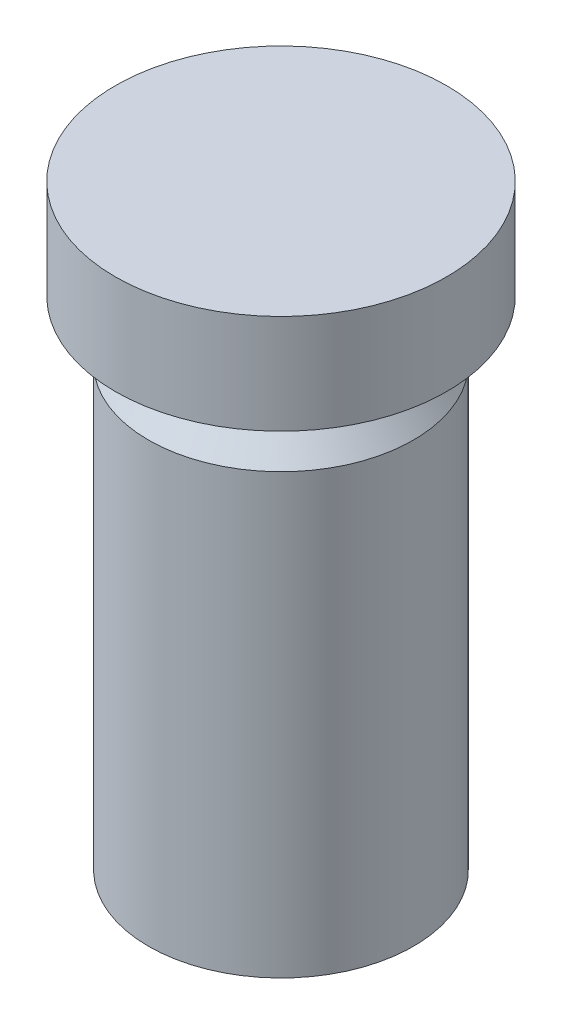
ISO-10303-21;
HEADER;
FILE_DESCRIPTION(('STEP AP214'),'2;1');
FILE_NAME('part.step','',(''),(''),'','','');
FILE_SCHEMA(('AUTOMOTIVE_DESIGN { 1 0 10303 214 1 1 1 1 }'));
ENDSEC;
DATA;
#1=APPLICATION_CONTEXT('core data for automotive mechanical design processes');
#2=APPLICATION_PROTOCOL_DEFINITION('international standard','automotive_design',2000,#1);
#3=PRODUCT_CONTEXT('',#1,'mechanical');
#4=PRODUCT('Part','Part','',(#3));
#5=PRODUCT_RELATED_PRODUCT_CATEGORY('part','',(#4));
#6=PRODUCT_DEFINITION_FORMATION('','',#4);
#7=PRODUCT_DEFINITION_CONTEXT('part definition',#1,'design');
#8=PRODUCT_DEFINITION('design','',#6,#7);
#9=PRODUCT_DEFINITION_SHAPE('','',#8);
#10=(LENGTH_UNIT() NAMED_UNIT(*) SI_UNIT(.MILLI.,.METRE.));
#11=(NAMED_UNIT(*) PLANE_ANGLE_UNIT() SI_UNIT($,.RADIAN.));
#12=(NAMED_UNIT(*) SI_UNIT($,.STERADIAN.) SOLID_ANGLE_UNIT());
#13=UNCERTAINTY_MEASURE_WITH_UNIT(LENGTH_MEASURE(1.E-05),#10,'distance_accuracy_value','');
#14=(GEOMETRIC_REPRESENTATION_CONTEXT(3) GLOBAL_UNCERTAINTY_ASSIGNED_CONTEXT((#13)) GLOBAL_UNIT_ASSIGNED_CONTEXT((#10,
#11,#12)) REPRESENTATION_CONTEXT('',''));
#15=CARTESIAN_POINT('',(0.,0.,0.));
#16=DIRECTION('',(0.,0.,1.));
#17=DIRECTION('',(1.,0.,0.));
#18=AXIS2_PLACEMENT_3D('',#15,#16,#17);
#19=CARTESIAN_POINT('',(12.7,12.7,0.));
#20=DIRECTION('',(0.,-1.,0.));
#21=DIRECTION('',(0.,0.,-1.));
#22=AXIS2_PLACEMENT_3D('',#19,#20,#21);
#23=CYLINDRICAL_SURFACE('',#22,12.7);
#24=CARTESIAN_POINT('',(12.7,30.1625,-12.7));
#25=CARTESIAN_POINT('',(12.5710718011046,30.1625005954063,-12.7000004391515));
#26=CARTESIAN_POINT('',(12.4421518971517,30.1572605774695,-12.6980324893377));
#27=CARTESIAN_POINT('',(12.1852346848315,30.1363527234142,-12.690214171391));
#28=CARTESIAN_POINT('',(12.0572376846443,30.1206815535446,-12.684362562059));
#29=CARTESIAN_POINT('',(11.8032240210477,30.0790762542192,-12.6689374567912));
#30=CARTESIAN_POINT('',(11.6772063412394,30.0531475839992,-12.6593659407079));
#31=CARTESIAN_POINT('',(11.4279276732524,29.9912677632913,-12.6367521431812));
#32=CARTESIAN_POINT('',(11.3046677761893,29.9553127190563,-12.6237085134305));
#33=CARTESIAN_POINT('',(11.0620657342932,29.8738023828647,-12.5945248608077));
#34=CARTESIAN_POINT('',(10.9427150393306,29.828269920639,-12.5783922093087));
#35=CARTESIAN_POINT('',(10.7083679490045,29.7279419462459,-12.5434234349378));
#36=CARTESIAN_POINT('',(10.5933731876203,29.673142999378,-12.5245863100221));
#37=CARTESIAN_POINT('',(10.256019626224,29.4954659374647,-12.4647079565755));
#38=CARTESIAN_POINT('',(10.0411043786232,29.3592442657505,-12.420276146485));
#39=CARTESIAN_POINT('',(9.62864282168642,29.0492991036915,-12.3249108141382));
#40=CARTESIAN_POINT('',(9.432076512313,28.8743395059155,-12.2737934975325));
#41=CARTESIAN_POINT('',(9.07018853426082,28.4942887712605,-12.1716815955058));
#42=CARTESIAN_POINT('',(8.90487642917645,28.2891884455146,-12.12068705235));
#43=CARTESIAN_POINT('',(8.68082594505707,27.9585833498682,-12.0475207155869));
#44=CARTESIAN_POINT('',(8.60903903001211,27.8421704354132,-12.0232704595791));
#45=CARTESIAN_POINT('',(8.47558409658708,27.60327168298,-11.9770317772768));
#46=CARTESIAN_POINT('',(8.41391202072701,27.4807883059171,-11.9550424453594));
#47=CARTESIAN_POINT('',(8.30120355614053,27.230529574276,-11.9140334195576));
#48=CARTESIAN_POINT('',(8.25016841164608,27.1027536027011,-11.895014073146));
#49=CARTESIAN_POINT('',(8.1592467475764,26.8428797564759,-11.8606038776407));
#50=CARTESIAN_POINT('',(8.11935485065113,26.710784000904,-11.845211278966));
#51=CARTESIAN_POINT('',(8.05250026155148,26.4486647102379,-11.8191362517945));
#52=CARTESIAN_POINT('',(8.02507844839581,26.3187747410199,-11.8082879802606));
#53=CARTESIAN_POINT('',(7.98115938665973,26.056933796039,-11.7908059089633));
#54=CARTESIAN_POINT('',(7.96465736053959,25.9249837474849,-11.7841702661752));
#55=CARTESIAN_POINT('',(7.94274722183763,25.6600367857739,-11.7753422974817));
#56=CARTESIAN_POINT('',(7.93733744913717,25.5270400322633,-11.7731493066689));
#57=CARTESIAN_POINT('',(7.93766997747972,25.2610655524867,-11.7732838941446));
#58=CARTESIAN_POINT('',(7.94341184596392,25.1280878256828,-11.7756112970925));
#59=CARTESIAN_POINT('',(7.96530002821411,24.8712010876881,-11.7844279806059));
#60=CARTESIAN_POINT('',(7.98080010191521,24.747227484038,-11.7906586483712));
#61=CARTESIAN_POINT('',(8.02144117672384,24.5010779525942,-11.8068439953055));
#62=CARTESIAN_POINT('',(8.0465853802189,24.3789026359394,-11.8167999114375));
#63=CARTESIAN_POINT('',(8.1062746458386,24.137234998178,-11.8401314682397));
#64=CARTESIAN_POINT('',(8.14081727006621,24.017741989985,-11.8535062220285));
#65=CARTESIAN_POINT('',(8.2189986823398,23.7821417782686,-11.8832811002292));
#66=CARTESIAN_POINT('',(8.26264096099314,23.6660358935779,-11.8996823853334));
#67=CARTESIAN_POINT('',(8.40850733766983,23.3196343234002,-11.9534099589664));
#68=CARTESIAN_POINT('',(8.52458868067482,23.0956239668915,-11.994814218831));
#69=CARTESIAN_POINT('',(8.78980638400865,22.6696349349158,-12.0838691502458));
#70=CARTESIAN_POINT('',(8.93895415700948,22.4676639021853,-12.1315219761239));
#71=CARTESIAN_POINT('',(9.27792500648297,22.0770443699526,-12.2316243564158));
#72=CARTESIAN_POINT('',(9.46980808981164,21.8902035155513,-12.2841810464491));
#73=CARTESIAN_POINT('',(9.88278345021682,21.5508240069171,-12.3854126045143));
#74=CARTESIAN_POINT('',(10.1038802082091,21.3982906246264,-12.4340868752041));
#75=CARTESIAN_POINT('',(10.5736278343806,21.1298467986516,-12.5230379705438));
#76=CARTESIAN_POINT('',(10.8226519179686,21.014539149622,-12.5631733018036));
#77=CARTESIAN_POINT('',(11.3384430651297,20.8280550115416,-12.6294743248123));
#78=CARTESIAN_POINT('',(11.6052021897442,20.7568589216155,-12.6556462204643));
#79=CARTESIAN_POINT('',(12.1336585943115,20.6640977165932,-12.6899810657478));
#80=CARTESIAN_POINT('',(12.3948710328095,20.6400952886216,-12.6990274563849));
#81=CARTESIAN_POINT('',(12.9177175840207,20.6353058082458,-12.7008221351573));
#82=CARTESIAN_POINT('',(13.1793515903896,20.654509174544,-12.6935740367515));
#83=CARTESIAN_POINT('',(13.6850821083539,20.7337345655392,-12.664176752618));
#84=CARTESIAN_POINT('',(13.9294662020618,20.7921598032184,-12.642610834321));
#85=CARTESIAN_POINT('',(14.4047896863005,20.9460651283998,-12.5873345164096));
#86=CARTESIAN_POINT('',(14.6357273236956,21.04155003532,-12.553622537304));
#87=CARTESIAN_POINT('',(15.0852131351544,21.2699193574626,-12.4761501195969));
#88=CARTESIAN_POINT('',(15.3031978923553,21.4038202381354,-12.4321235343286));
#89=CARTESIAN_POINT('',(15.7143162556014,21.7040305262253,-12.3388985451331));
#90=CARTESIAN_POINT('',(15.9074406432168,21.8703518982788,-12.2896982349627));
#91=CARTESIAN_POINT('',(16.2751699394773,22.242195449066,-12.1879714004416));
#92=CARTESIAN_POINT('',(16.4480503046058,22.4494321310017,-12.1354175087727));
#93=CARTESIAN_POINT('',(16.6795799282194,22.7803514868271,-12.0606614872133));
#94=CARTESIAN_POINT('',(16.7521600504789,22.8940767088494,-12.0364085430368));
#95=CARTESIAN_POINT('',(16.8875633231427,23.1275779969996,-11.9899719320665));
#96=CARTESIAN_POINT('',(16.9503905868838,23.2473514838268,-11.9677873944929));
#97=CARTESIAN_POINT('',(17.066048838949,23.4927720298473,-11.926081521209));
#98=CARTESIAN_POINT('',(17.1188319478249,23.6184438285704,-11.9065730594557));
#99=CARTESIAN_POINT('',(17.2135386796156,23.8742339946091,-11.8709952555923));
#100=CARTESIAN_POINT('',(17.2554669222522,24.0043504435496,-11.8549244509576));
#101=CARTESIAN_POINT('',(17.328050450062,24.2680748940391,-11.8267775290678));
#102=CARTESIAN_POINT('',(17.3587091223458,24.4016818335566,-11.8147002116652));
#103=CARTESIAN_POINT('',(17.4084265682312,24.6713572650744,-11.7949751134418));
#104=CARTESIAN_POINT('',(17.4274861508629,24.807425584713,-11.7873270236865));
#105=CARTESIAN_POINT('',(17.4529337554882,25.0720629367627,-11.777087664525));
#106=CARTESIAN_POINT('',(17.4600592017125,25.2005501839,-11.7742022868169));
#107=CARTESIAN_POINT('',(17.4638867549028,25.4577514871477,-11.7726542639279));
#108=CARTESIAN_POINT('',(17.4605853464728,25.5864656051264,-11.7739930429138));
#109=CARTESIAN_POINT('',(17.4435905406342,25.8430307890019,-11.7808502108187));
#110=CARTESIAN_POINT('',(17.4299020372976,25.9708822327501,-11.7863666313622));
#111=CARTESIAN_POINT('',(17.3922784330999,26.2248756930146,-11.80139534785));
#112=CARTESIAN_POINT('',(17.3683394738958,26.3510170473779,-11.8109091484107));
#113=CARTESIAN_POINT('',(17.3113495390658,26.5967755102686,-11.8332734945099));
#114=CARTESIAN_POINT('',(17.2786037825823,26.7164736801564,-11.8460115540591));
#115=CARTESIAN_POINT('',(17.2040083392094,26.9526345542296,-11.8745735365837));
#116=CARTESIAN_POINT('',(17.1621554622478,27.0690961085215,-11.8903985406625));
#117=CARTESIAN_POINT('',(17.0234252910003,27.4125219099767,-11.9418495887242));
#118=CARTESIAN_POINT('',(16.9133335127973,27.633710731497,-11.9814694128746));
#119=CARTESIAN_POINT('',(16.6545255781381,28.0664812963956,-12.0694374578871));
#120=CARTESIAN_POINT('',(16.5040872568636,28.2769516521454,-12.1181343502492));
#121=CARTESIAN_POINT('',(16.1713400970661,28.6707130881157,-12.2176039115664));
#122=CARTESIAN_POINT('',(15.9890211292842,28.8539954957504,-12.2683772363149));
#123=CARTESIAN_POINT('',(15.6896381635531,29.1097185520455,-12.3435601748552));
#124=CARTESIAN_POINT('',(15.5824309153522,29.1936212173889,-12.3690940326457));
#125=CARTESIAN_POINT('',(15.3610019067973,29.3520858235818,-12.4186116409962));
#126=CARTESIAN_POINT('',(15.2467827352107,29.4266511811786,-12.4425959570068));
#127=CARTESIAN_POINT('',(15.0119768941911,29.5659112919309,-12.4883577927198));
#128=CARTESIAN_POINT('',(14.8913868760936,29.6306007832035,-12.5101341339479));
#129=CARTESIAN_POINT('',(14.6447422699535,29.7494959932332,-12.550840222474));
#130=CARTESIAN_POINT('',(14.5186900309255,29.8037061648838,-12.5697711780747));
#131=CARTESIAN_POINT('',(14.2563193533074,29.9033120127386,-12.6050047594573));
#132=CARTESIAN_POINT('',(14.1197931786885,29.9482159038915,-12.6211554056409));
#133=CARTESIAN_POINT('',(13.8428932731948,30.0255653859771,-12.6492351365663));
#134=CARTESIAN_POINT('',(13.7025212568226,30.0580164346761,-12.6611660705214));
#135=CARTESIAN_POINT('',(13.4191295539323,30.110096688588,-12.6804186969382));
#136=CARTESIAN_POINT('',(13.2761103394025,30.1297281572778,-12.6877412030743));
#137=CARTESIAN_POINT('',(12.9887238476533,30.1559287430101,-12.6975313349649));
#138=CARTESIAN_POINT('',(12.8443567243266,30.1624993333429,-12.6999995082963));
#139=CARTESIAN_POINT('',(12.7,30.1625,-12.7));
#140=B_SPLINE_CURVE_WITH_KNOTS('',3,(#24,#25,#26,#27,#28,#29,#30,#31,#32,#33,#34,#35,#36,#37,
#38,#39,#40,#41,#42,#43,#44,#45,#46,#47,#48,#49,#50,#51,#52,#53,#54,#55,#56,#57,#58,#59,#60,#61,
#62,#63,#64,#65,#66,#67,#68,#69,#70,#71,#72,#73,#74,#75,#76,#77,#78,#79,#80,#81,#82,#83,#84,#85,
#86,#87,#88,#89,#90,#91,#92,#93,#94,#95,#96,#97,#98,#99,#100,#101,#102,#103,#104,#105,#106,#107,
#108,#109,#110,#111,#112,#113,#114,#115,#116,#117,#118,#119,#120,#121,#122,#123,#124,#125,#126,
#127,#128,#129,#130,#131,#132,#133,#134,#135,#136,#137,#138,#139),.UNSPECIFIED.,.T.,.F.,(4,2,2,
2,2,2,2,2,2,2,2,2,2,2,2,2,2,2,2,2,2,2,2,2,2,2,2,2,2,2,2,2,2,2,2,2,2,2,2,2,2,2,2,2,2,2,2,2,2,2,2,
2,2,2,2,2,2,4),(0.,0.386649409269856,0.773422449391235,1.15998991792084,1.54670771968232,
1.93251394047669,2.31846347831504,3.08977261132208,3.89061177106316,4.69169558745043,
5.10796837855457,5.52407377484765,5.94022781688393,6.35618068891629,6.75524795726278,
7.15414051318064,7.55297336460987,7.95179074609935,8.32663225746464,8.70159834496886,
9.07646726097203,9.45148024129298,10.2149175741571,10.9786188139995,11.7936464762813,
12.6087992963551,13.4365572732022,14.2639471733076,15.0473504813099,15.8305800792683,
16.5837145119512,17.3369469186982,18.1123114019116,18.8879625735001,19.7086156005864,
20.1194383594197,20.5300873773275,20.942647399041,21.3550315496519,21.767291655161,
22.1795230024586,22.5651895951795,22.9509862285962,23.3366011995719,23.7223614464794,
24.0961725445644,24.470114793818,25.2174381731197,26.0039360041012,26.7906841801823,
27.2057976969225,27.6207588668993,28.0359403632185,28.4509450501127,28.8841792742048,
29.3172234052252,29.7501910555336,30.1831098635461),.UNSPECIFIED.);
#141=CARTESIAN_POINT('',(12.7,30.1625,-12.7));
#142=VERTEX_POINT('',#141);
#143=EDGE_CURVE('E39',#142,#142,#140,.T.);
#144=ORIENTED_EDGE('',*,*,#143,.T.);
#145=EDGE_LOOP('',(#144));
#146=FACE_BOUND('',#145,.T.);
#147=CARTESIAN_POINT('',(12.7,0.,0.));
#148=DIRECTION('',(0.,-1.,0.));
#149=DIRECTION('',(0.,0.,-1.));
#150=AXIS2_PLACEMENT_3D('',#147,#148,#149);
#151=CIRCLE('',#150,12.7);
#152=CARTESIAN_POINT('',(12.7,0.,-12.7));
#153=VERTEX_POINT('',#152);
#154=EDGE_CURVE('E71',#153,#153,#151,.T.);
#155=ORIENTED_EDGE('',*,*,#154,.F.);
#156=EDGE_LOOP('',(#155));
#157=FACE_BOUND('',#156,.T.);
#158=CARTESIAN_POINT('',(12.7,42.0178088930973,0.));
#159=DIRECTION('',(0.,-1.,0.));
#160=DIRECTION('',(0.,0.,-1.));
#161=AXIS2_PLACEMENT_3D('',#158,#159,#160);
#162=CIRCLE('',#161,12.7);
#163=CARTESIAN_POINT('',(12.7,42.0178088930973,-12.7));
#164=VERTEX_POINT('',#163);
#165=EDGE_CURVE('E11',#164,#164,#162,.T.);
#166=ORIENTED_EDGE('',*,*,#165,.T.);
#167=EDGE_LOOP('',(#166));
#168=FACE_BOUND('',#167,.T.);
#169=ADVANCED_FACE('F35',(#146,#157,#168),#23,.T.);
#170=CARTESIAN_POINT('',(12.7,44.45,0.));
#171=DIRECTION('',(0.,-1.,0.));
#172=DIRECTION('',(0.,0.,-1.));
#173=AXIS2_PLACEMENT_3D('',#170,#171,#172);
#174=CONICAL_SURFACE('',#173,10.6591493392452,0.698131700797735);
#175=ORIENTED_EDGE('',*,*,#165,.F.);
#176=EDGE_LOOP('',(#175));
#177=FACE_BOUND('',#176,.T.);
#178=CARTESIAN_POINT('',(12.7,44.45,0.));
#179=DIRECTION('',(0.,-1.,0.));
#180=DIRECTION('',(0.,0.,-1.));
#181=AXIS2_PLACEMENT_3D('',#178,#179,#180);
#182=CIRCLE('',#181,10.6591493392452);
#183=CARTESIAN_POINT('',(12.7,44.45,-10.6591493392452));
#184=VERTEX_POINT('',#183);
#185=EDGE_CURVE('E47',#184,#184,#182,.T.);
#186=ORIENTED_EDGE('',*,*,#185,.T.);
#187=EDGE_LOOP('',(#186));
#188=FACE_BOUND('',#187,.T.);
#189=ADVANCED_FACE('F98',(#177,#188),#174,.T.);
#190=CARTESIAN_POINT('',(2.04085066075477,44.45,0.));
#191=DIRECTION('',(0.,-1.,0.));
#192=DIRECTION('',(0.,0.,-1.));
#193=AXIS2_PLACEMENT_3D('',#190,#191,#192);
#194=PLANE('',#193);
#195=ORIENTED_EDGE('',*,*,#185,.F.);
#196=EDGE_LOOP('',(#195));
#197=FACE_BOUND('',#196,.T.);
#198=CARTESIAN_POINT('',(12.7,44.45,0.));
#199=DIRECTION('',(0.,-1.,0.));
#200=DIRECTION('',(0.,0.,-1.));
#201=AXIS2_PLACEMENT_3D('',#198,#199,#200);
#202=CIRCLE('',#201,3.175);
#203=CARTESIAN_POINT('',(12.7,44.45,-3.175));
#204=VERTEX_POINT('',#203);
#205=EDGE_CURVE('E51',#204,#204,#202,.T.);
#206=ORIENTED_EDGE('',*,*,#205,.T.);
#207=EDGE_LOOP('',(#206));
#208=FACE_BOUND('',#207,.T.);
#209=ADVANCED_FACE('F102',(#197,#208),#194,.F.);
#210=CARTESIAN_POINT('',(12.7,12.7,0.));
#211=DIRECTION('',(0.,-1.,0.));
#212=DIRECTION('',(0.,0.,-1.));
#213=AXIS2_PLACEMENT_3D('',#210,#211,#212);
#214=CYLINDRICAL_SURFACE('',#213,3.175);
#215=ORIENTED_EDGE('',*,*,#205,.F.);
#216=EDGE_LOOP('',(#215));
#217=FACE_BOUND('',#216,.T.);
#218=CARTESIAN_POINT('',(12.7,47.625,0.));
#219=DIRECTION('',(0.,-1.,0.));
#220=DIRECTION('',(0.,0.,-1.));
#221=AXIS2_PLACEMENT_3D('',#218,#219,#220);
#222=CIRCLE('',#221,3.175);
#223=CARTESIAN_POINT('',(12.7,47.625,-3.175));
#224=VERTEX_POINT('',#223);
#225=EDGE_CURVE('E56',#224,#224,#222,.T.);
#226=ORIENTED_EDGE('',*,*,#225,.T.);
#227=EDGE_LOOP('',(#226));
#228=FACE_BOUND('',#227,.T.);
#229=ADVANCED_FACE('F107',(#217,#228),#214,.T.);
#230=CARTESIAN_POINT('',(-3.175,47.625,0.));
#231=DIRECTION('',(0.,1.,0.));
#232=DIRECTION('',(0.,0.,1.));
#233=AXIS2_PLACEMENT_3D('',#230,#231,#232);
#234=PLANE('',#233);
#235=ORIENTED_EDGE('',*,*,#225,.F.);
#236=EDGE_LOOP('',(#235));
#237=FACE_BOUND('',#236,.T.);
#238=CARTESIAN_POINT('',(12.7,47.625,0.));
#239=DIRECTION('',(0.,-1.,0.));
#240=DIRECTION('',(0.,0.,-1.));
#241=AXIS2_PLACEMENT_3D('',#238,#239,#240);
#242=CIRCLE('',#241,15.875);
#243=CARTESIAN_POINT('',(12.7,47.625,-15.875));
#244=VERTEX_POINT('',#243);
#245=EDGE_CURVE('E59',#244,#244,#242,.T.);
#246=ORIENTED_EDGE('',*,*,#245,.T.);
#247=EDGE_LOOP('',(#246));
#248=FACE_BOUND('',#247,.T.);
#249=ADVANCED_FACE('F114',(#237,#248),#234,.F.);
#250=CARTESIAN_POINT('',(12.7,12.7,0.));
#251=DIRECTION('',(0.,-1.,0.));
#252=DIRECTION('',(0.,0.,-1.));
#253=AXIS2_PLACEMENT_3D('',#250,#251,#252);
#254=CYLINDRICAL_SURFACE('',#253,15.875);
#255=ORIENTED_EDGE('',*,*,#245,.F.);
#256=EDGE_LOOP('',(#255));
#257=FACE_BOUND('',#256,.T.);
#258=CARTESIAN_POINT('',(12.7,57.15,0.));
#259=DIRECTION('',(0.,-1.,0.));
#260=DIRECTION('',(0.,0.,-1.));
#261=AXIS2_PLACEMENT_3D('',#258,#259,#260);
#262=CIRCLE('',#261,15.875);
#263=CARTESIAN_POINT('',(12.7,57.15,-15.875));
#264=VERTEX_POINT('',#263);
#265=EDGE_CURVE('E62',#264,#264,#262,.T.);
#266=ORIENTED_EDGE('',*,*,#265,.T.);
#267=EDGE_LOOP('',(#266));
#268=FACE_BOUND('',#267,.T.);
#269=ADVANCED_FACE('F118',(#257,#268),#254,.T.);
#270=CARTESIAN_POINT('',(-3.175,57.15,0.));
#271=DIRECTION('',(0.,-1.,0.));
#272=DIRECTION('',(0.,0.,-1.));
#273=AXIS2_PLACEMENT_3D('',#270,#271,#272);
#274=PLANE('',#273);
#275=ORIENTED_EDGE('',*,*,#265,.F.);
#276=EDGE_LOOP('',(#275));
#277=FACE_BOUND('',#276,.T.);
#278=ADVANCED_FACE('F122',(#277),#274,.F.);
#279=CARTESIAN_POINT('',(2.2225,12.7,0.));
#280=DIRECTION('',(0.,1.,0.));
#281=DIRECTION('',(0.,0.,1.));
#282=AXIS2_PLACEMENT_3D('',#279,#280,#281);
#283=PLANE('',#282);
#284=CARTESIAN_POINT('',(12.7,12.7,0.));
#285=DIRECTION('',(0.,-1.,0.));
#286=DIRECTION('',(0.,0.,-1.));
#287=AXIS2_PLACEMENT_3D('',#284,#285,#286);
#288=CIRCLE('',#287,10.4775);
#289=CARTESIAN_POINT('',(12.7,12.7,-10.4775));
#290=VERTEX_POINT('',#289);
#291=EDGE_CURVE('E65',#290,#290,#288,.T.);
#292=ORIENTED_EDGE('',*,*,#291,.T.);
#293=EDGE_LOOP('',(#292));
#294=FACE_BOUND('',#293,.T.);
#295=ADVANCED_FACE('F126',(#294),#283,.F.);
#296=CARTESIAN_POINT('',(12.7,12.7,0.));
#297=DIRECTION('',(0.,-1.,0.));
#298=DIRECTION('',(0.,0.,-1.));
#299=AXIS2_PLACEMENT_3D('',#296,#297,#298);
#300=CYLINDRICAL_SURFACE('',#299,10.4775);
#301=ORIENTED_EDGE('',*,*,#291,.F.);
#302=EDGE_LOOP('',(#301));
#303=FACE_BOUND('',#302,.T.);
#304=CARTESIAN_POINT('',(12.7,0.,0.));
#305=DIRECTION('',(0.,-1.,0.));
#306=DIRECTION('',(0.,0.,-1.));
#307=AXIS2_PLACEMENT_3D('',#304,#305,#306);
#308=CIRCLE('',#307,10.4775);
#309=CARTESIAN_POINT('',(12.7,0.,-10.4775));
#310=VERTEX_POINT('',#309);
#311=EDGE_CURVE('E68',#310,#310,#308,.T.);
#312=ORIENTED_EDGE('',*,*,#311,.T.);
#313=EDGE_LOOP('',(#312));
#314=FACE_BOUND('',#313,.T.);
#315=ADVANCED_FACE('F93',(#303,#314),#300,.F.);
#316=CARTESIAN_POINT('',(0.,0.,0.));
#317=DIRECTION('',(0.,1.,0.));
#318=DIRECTION('',(0.,0.,1.));
#319=AXIS2_PLACEMENT_3D('',#316,#317,#318);
#320=PLANE('',#319);
#321=ORIENTED_EDGE('',*,*,#311,.F.);
#322=EDGE_LOOP('',(#321));
#323=FACE_BOUND('',#322,.T.);
#324=ORIENTED_EDGE('',*,*,#154,.T.);
#325=EDGE_LOOP('',(#324));
#326=FACE_BOUND('',#325,.T.);
#327=ADVANCED_FACE('F86',(#323,#326),#320,.F.);
#328=CARTESIAN_POINT('',(12.7,25.4,-15.875));
#329=DIRECTION('',(0.,0.,1.));
#330=DIRECTION('',(1.,0.,0.));
#331=AXIS2_PLACEMENT_3D('',#328,#329,#330);
#332=CYLINDRICAL_SURFACE('',#331,4.7625);
#333=CARTESIAN_POINT('',(12.7,25.4,0.));
#334=DIRECTION('',(0.,0.,1.));
#335=DIRECTION('',(1.,0.,0.));
#336=AXIS2_PLACEMENT_3D('',#333,#334,#335);
#337=CIRCLE('',#336,4.7625);
#338=CARTESIAN_POINT('',(17.4625,25.4,0.));
#339=VERTEX_POINT('',#338);
#340=EDGE_CURVE('E74',#339,#339,#337,.T.);
#341=ORIENTED_EDGE('',*,*,#340,.T.);
#342=EDGE_LOOP('',(#341));
#343=FACE_BOUND('',#342,.T.);
#344=ORIENTED_EDGE('',*,*,#143,.F.);
#345=EDGE_LOOP('',(#344));
#346=FACE_BOUND('',#345,.T.);
#347=ADVANCED_FACE('F83',(#343,#346),#332,.F.);
#348=CARTESIAN_POINT('',(12.7,25.4,0.));
#349=DIRECTION('',(0.,0.,1.));
#350=DIRECTION('',(1.,0.,0.));
#351=AXIS2_PLACEMENT_3D('',#348,#349,#350);
#352=PLANE('',#351);
#353=ORIENTED_EDGE('',*,*,#340,.F.);
#354=EDGE_LOOP('',(#353));
#355=FACE_BOUND('',#354,.T.);
#356=ADVANCED_FACE('F85',(#355),#352,.F.);
#357=CLOSED_SHELL('',(#169,#189,#209,#229,#249,#269,#278,#295,#315,#327,#347,#356));
#358=MANIFOLD_SOLID_BREP('B2',#357);
#359=ADVANCED_BREP_SHAPE_REPRESENTATION('',(#18,#358),#14);
#360=SHAPE_DEFINITION_REPRESENTATION(#9,#359);
ENDSEC;
END-ISO-10303-21;
